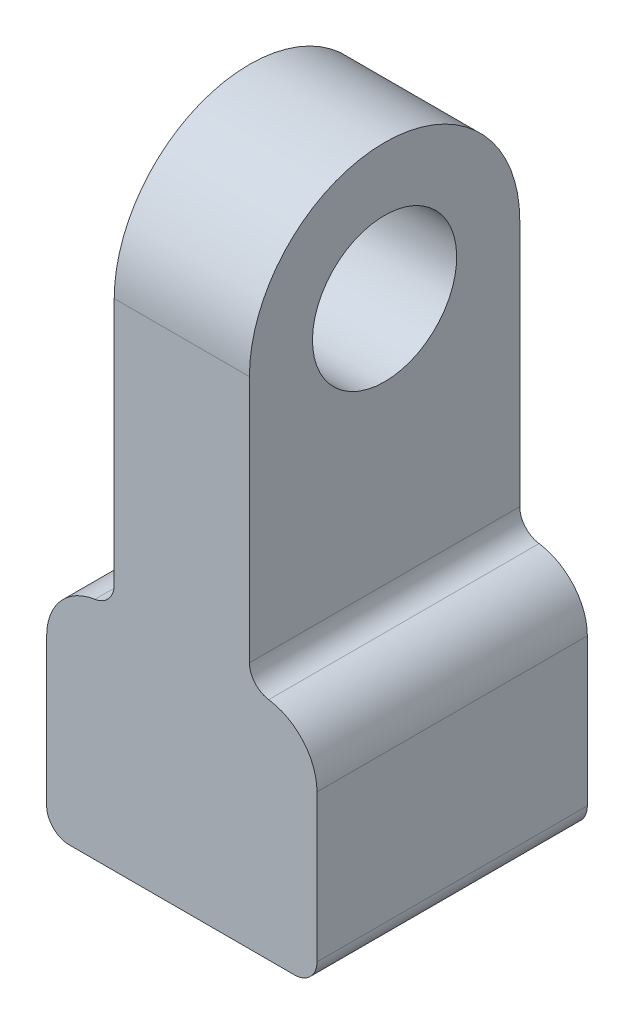
ISO-10303-21;
HEADER;
FILE_DESCRIPTION(('STEP AP214'),'2;1');
FILE_NAME('part.step','',(''),(''),'','','');
FILE_SCHEMA(('AUTOMOTIVE_DESIGN { 1 0 10303 214 1 1 1 1 }'));
ENDSEC;
DATA;
#1=APPLICATION_CONTEXT('core data for automotive mechanical design processes');
#2=APPLICATION_PROTOCOL_DEFINITION('international standard','automotive_design',2000,#1);
#3=PRODUCT_CONTEXT('',#1,'mechanical');
#4=PRODUCT('Part','Part','',(#3));
#5=PRODUCT_RELATED_PRODUCT_CATEGORY('part','',(#4));
#6=PRODUCT_DEFINITION_FORMATION('','',#4);
#7=PRODUCT_DEFINITION_CONTEXT('part definition',#1,'design');
#8=PRODUCT_DEFINITION('design','',#6,#7);
#9=PRODUCT_DEFINITION_SHAPE('','',#8);
#10=(LENGTH_UNIT() NAMED_UNIT(*) SI_UNIT(.MILLI.,.METRE.));
#11=(NAMED_UNIT(*) PLANE_ANGLE_UNIT() SI_UNIT($,.RADIAN.));
#12=(NAMED_UNIT(*) SI_UNIT($,.STERADIAN.) SOLID_ANGLE_UNIT());
#13=UNCERTAINTY_MEASURE_WITH_UNIT(LENGTH_MEASURE(1.E-05),#10,'distance_accuracy_value','');
#14=(GEOMETRIC_REPRESENTATION_CONTEXT(3) GLOBAL_UNCERTAINTY_ASSIGNED_CONTEXT((#13)) GLOBAL_UNIT_ASSIGNED_CONTEXT((#10,
#11,#12)) REPRESENTATION_CONTEXT('',''));
#15=CARTESIAN_POINT('',(0.,0.,0.));
#16=DIRECTION('',(0.,0.,1.));
#17=DIRECTION('',(1.,0.,0.));
#18=AXIS2_PLACEMENT_3D('',#15,#16,#17);
#19=CARTESIAN_POINT('',(-1.5,14.,3.));
#20=DIRECTION('',(1.,0.,0.));
#21=DIRECTION('',(0.,1.,0.));
#22=AXIS2_PLACEMENT_3D('',#19,#20,#21);
#23=PLANE('',#22);
#24=CARTESIAN_POINT('',(-1.5,11.,0.));
#25=DIRECTION('',(-1.,0.,0.));
#26=DIRECTION('',(0.,-1.,0.));
#27=AXIS2_PLACEMENT_3D('',#24,#25,#26);
#28=CIRCLE('',#27,1.6);
#29=CARTESIAN_POINT('',(-1.5,9.4,0.));
#30=VERTEX_POINT('',#29);
#31=EDGE_CURVE('E145',#30,#30,#28,.T.);
#32=ORIENTED_EDGE('',*,*,#31,.F.);
#33=EDGE_LOOP('',(#32));
#34=FACE_BOUND('',#33,.T.);
#35=DIRECTION('',(0.,-1.,0.));
#36=VECTOR('',#35,1.);
#37=CARTESIAN_POINT('',(-1.5,14.,3.));
#38=LINE('',#37,#36);
#39=CARTESIAN_POINT('',(-1.5,11.,3.));
#40=VERTEX_POINT('',#39);
#41=CARTESIAN_POINT('',(-1.5,5.5,3.));
#42=VERTEX_POINT('',#41);
#43=EDGE_CURVE('E129',#40,#42,#38,.T.);
#44=ORIENTED_EDGE('',*,*,#43,.F.);
#45=CARTESIAN_POINT('',(-1.5,11.,0.));
#46=DIRECTION('',(-1.,0.,0.));
#47=DIRECTION('',(0.,-1.,0.));
#48=AXIS2_PLACEMENT_3D('',#45,#46,#47);
#49=CIRCLE('',#48,3.);
#50=CARTESIAN_POINT('',(-1.5,11.,-3.));
#51=VERTEX_POINT('',#50);
#52=EDGE_CURVE('E121',#40,#51,#49,.T.);
#53=ORIENTED_EDGE('',*,*,#52,.T.);
#54=DIRECTION('',(0.,-1.,0.));
#55=VECTOR('',#54,1.);
#56=CARTESIAN_POINT('',(-1.5,14.,-3.));
#57=LINE('',#56,#55);
#58=CARTESIAN_POINT('',(-1.5,5.5,-3.));
#59=VERTEX_POINT('',#58);
#60=EDGE_CURVE('E155',#51,#59,#57,.T.);
#61=ORIENTED_EDGE('',*,*,#60,.T.);
#62=DIRECTION('',(0.,0.,-1.));
#63=VECTOR('',#62,1.);
#64=CARTESIAN_POINT('',(-1.5,5.5,3.));
#65=LINE('',#64,#63);
#66=EDGE_CURVE('E134',#59,#42,#65,.F.);
#67=ORIENTED_EDGE('',*,*,#66,.T.);
#68=EDGE_LOOP('',(#44,#53,#61,#67));
#69=FACE_BOUND('',#68,.T.);
#70=ADVANCED_FACE('F33',(#34,#69),#23,.F.);
#71=CARTESIAN_POINT('',(1.5,14.,3.));
#72=DIRECTION('',(-1.,0.,0.));
#73=DIRECTION('',(0.,-1.,0.));
#74=AXIS2_PLACEMENT_3D('',#71,#72,#73);
#75=PLANE('',#74);
#76=CARTESIAN_POINT('',(1.5,11.,0.));
#77=DIRECTION('',(-1.,0.,0.));
#78=DIRECTION('',(0.,-1.,0.));
#79=AXIS2_PLACEMENT_3D('',#76,#77,#78);
#80=CIRCLE('',#79,1.6);
#81=CARTESIAN_POINT('',(1.5,9.4,0.));
#82=VERTEX_POINT('',#81);
#83=EDGE_CURVE('E158',#82,#82,#80,.T.);
#84=ORIENTED_EDGE('',*,*,#83,.T.);
#85=EDGE_LOOP('',(#84));
#86=FACE_BOUND('',#85,.T.);
#87=CARTESIAN_POINT('',(1.5,11.,0.));
#88=DIRECTION('',(-1.,0.,0.));
#89=DIRECTION('',(0.,-1.,0.));
#90=AXIS2_PLACEMENT_3D('',#87,#88,#89);
#91=CIRCLE('',#90,3.);
#92=CARTESIAN_POINT('',(1.5,11.,3.));
#93=VERTEX_POINT('',#92);
#94=CARTESIAN_POINT('',(1.5,11.,-3.));
#95=VERTEX_POINT('',#94);
#96=EDGE_CURVE('E48',#93,#95,#91,.T.);
#97=ORIENTED_EDGE('',*,*,#96,.F.);
#98=DIRECTION('',(0.,1.,0.));
#99=VECTOR('',#98,1.);
#100=CARTESIAN_POINT('',(1.5,14.,3.));
#101=LINE('',#100,#99);
#102=CARTESIAN_POINT('',(1.5,5.5,3.));
#103=VERTEX_POINT('',#102);
#104=EDGE_CURVE('E132',#103,#93,#101,.T.);
#105=ORIENTED_EDGE('',*,*,#104,.F.);
#106=DIRECTION('',(0.,0.,-1.));
#107=VECTOR('',#106,1.);
#108=CARTESIAN_POINT('',(1.5,5.5,-3.));
#109=LINE('',#108,#107);
#110=CARTESIAN_POINT('',(1.5,5.5,-3.));
#111=VERTEX_POINT('',#110);
#112=EDGE_CURVE('E184',#103,#111,#109,.T.);
#113=ORIENTED_EDGE('',*,*,#112,.T.);
#114=DIRECTION('',(0.,1.,0.));
#115=VECTOR('',#114,1.);
#116=CARTESIAN_POINT('',(1.5,14.,-3.));
#117=LINE('',#116,#115);
#118=EDGE_CURVE('E137',#111,#95,#117,.T.);
#119=ORIENTED_EDGE('',*,*,#118,.T.);
#120=EDGE_LOOP('',(#97,#105,#113,#119));
#121=FACE_BOUND('',#120,.T.);
#122=ADVANCED_FACE('F262',(#86,#121),#75,.F.);
#123=CARTESIAN_POINT('',(-3.,5.,3.));
#124=DIRECTION('',(1.,0.,0.));
#125=DIRECTION('',(0.,1.,0.));
#126=AXIS2_PLACEMENT_3D('',#123,#124,#125);
#127=PLANE('',#126);
#128=DIRECTION('',(0.,-1.,0.));
#129=VECTOR('',#128,1.);
#130=CARTESIAN_POINT('',(-3.,5.,3.));
#131=LINE('',#130,#129);
#132=CARTESIAN_POINT('',(-3.,3.76794919243112,3.));
#133=VERTEX_POINT('',#132);
#134=CARTESIAN_POINT('',(-3.,0.5,3.));
#135=VERTEX_POINT('',#134);
#136=EDGE_CURVE('E136',#133,#135,#131,.T.);
#137=ORIENTED_EDGE('',*,*,#136,.F.);
#138=DIRECTION('',(0.,0.,1.));
#139=VECTOR('',#138,1.);
#140=CARTESIAN_POINT('',(-3.,3.76794919243112,3.));
#141=LINE('',#140,#139);
#142=CARTESIAN_POINT('',(-3.,3.76794919243112,-3.));
#143=VERTEX_POINT('',#142);
#144=EDGE_CURVE('E210',#133,#143,#141,.F.);
#145=ORIENTED_EDGE('',*,*,#144,.T.);
#146=DIRECTION('',(0.,-1.,0.));
#147=VECTOR('',#146,1.);
#148=CARTESIAN_POINT('',(-3.,5.,-3.));
#149=LINE('',#148,#147);
#150=CARTESIAN_POINT('',(-3.,0.5,-3.));
#151=VERTEX_POINT('',#150);
#152=EDGE_CURVE('E157',#143,#151,#149,.T.);
#153=ORIENTED_EDGE('',*,*,#152,.T.);
#154=DIRECTION('',(0.,0.,-1.));
#155=VECTOR('',#154,1.);
#156=CARTESIAN_POINT('',(-3.,0.5,3.));
#157=LINE('',#156,#155);
#158=EDGE_CURVE('E181',#151,#135,#157,.F.);
#159=ORIENTED_EDGE('',*,*,#158,.T.);
#160=EDGE_LOOP('',(#137,#145,#153,#159));
#161=FACE_BOUND('',#160,.T.);
#162=ADVANCED_FACE('F237',(#161),#127,.F.);
#163=CARTESIAN_POINT('',(-3.,0.,3.));
#164=DIRECTION('',(0.,1.,0.));
#165=DIRECTION('',(0.,0.,1.));
#166=AXIS2_PLACEMENT_3D('',#163,#164,#165);
#167=PLANE('',#166);
#168=CARTESIAN_POINT('',(0.,0.,0.));
#169=DIRECTION('',(0.,-1.,0.));
#170=DIRECTION('',(0.,0.,-1.));
#171=AXIS2_PLACEMENT_3D('',#168,#169,#170);
#172=CIRCLE('',#171,2.05);
#173=CARTESIAN_POINT('',(0.,0.,-2.05));
#174=VERTEX_POINT('',#173);
#175=EDGE_CURVE('E223',#174,#174,#172,.T.);
#176=ORIENTED_EDGE('',*,*,#175,.F.);
#177=EDGE_LOOP('',(#176));
#178=FACE_BOUND('',#177,.T.);
#179=DIRECTION('',(1.,0.,0.));
#180=VECTOR('',#179,1.);
#181=CARTESIAN_POINT('',(-3.,0.,-3.));
#182=LINE('',#181,#180);
#183=CARTESIAN_POINT('',(-2.5,0.,-3.));
#184=VERTEX_POINT('',#183);
#185=CARTESIAN_POINT('',(2.5,0.,-3.));
#186=VERTEX_POINT('',#185);
#187=EDGE_CURVE('E160',#184,#186,#182,.T.);
#188=ORIENTED_EDGE('',*,*,#187,.T.);
#189=DIRECTION('',(0.,0.,-1.));
#190=VECTOR('',#189,1.);
#191=CARTESIAN_POINT('',(2.5,0.,3.));
#192=LINE('',#191,#190);
#193=CARTESIAN_POINT('',(2.5,0.,3.));
#194=VERTEX_POINT('',#193);
#195=EDGE_CURVE('E175',#186,#194,#192,.F.);
#196=ORIENTED_EDGE('',*,*,#195,.T.);
#197=DIRECTION('',(1.,0.,0.));
#198=VECTOR('',#197,1.);
#199=CARTESIAN_POINT('',(-3.,0.,3.));
#200=LINE('',#199,#198);
#201=CARTESIAN_POINT('',(-2.5,0.,3.));
#202=VERTEX_POINT('',#201);
#203=EDGE_CURVE('E139',#202,#194,#200,.T.);
#204=ORIENTED_EDGE('',*,*,#203,.F.);
#205=DIRECTION('',(0.,0.,-1.));
#206=VECTOR('',#205,1.);
#207=CARTESIAN_POINT('',(-2.5,0.,3.));
#208=LINE('',#207,#206);
#209=EDGE_CURVE('E172',#202,#184,#208,.T.);
#210=ORIENTED_EDGE('',*,*,#209,.T.);
#211=EDGE_LOOP('',(#188,#196,#204,#210));
#212=FACE_BOUND('',#211,.T.);
#213=ADVANCED_FACE('F233',(#178,#212),#167,.F.);
#214=CARTESIAN_POINT('',(3.,5.,3.));
#215=DIRECTION('',(-1.,0.,0.));
#216=DIRECTION('',(0.,-1.,0.));
#217=AXIS2_PLACEMENT_3D('',#214,#215,#216);
#218=PLANE('',#217);
#219=DIRECTION('',(0.,1.,0.));
#220=VECTOR('',#219,1.);
#221=CARTESIAN_POINT('',(3.,5.,-3.));
#222=LINE('',#221,#220);
#223=CARTESIAN_POINT('',(3.,0.5,-3.));
#224=VERTEX_POINT('',#223);
#225=CARTESIAN_POINT('',(3.,3.76794919243112,-3.));
#226=VERTEX_POINT('',#225);
#227=EDGE_CURVE('E142',#224,#226,#222,.T.);
#228=ORIENTED_EDGE('',*,*,#227,.T.);
#229=DIRECTION('',(0.,0.,1.));
#230=VECTOR('',#229,1.);
#231=CARTESIAN_POINT('',(3.,3.76794919243112,3.));
#232=LINE('',#231,#230);
#233=CARTESIAN_POINT('',(3.,3.76794919243112,3.));
#234=VERTEX_POINT('',#233);
#235=EDGE_CURVE('E205',#226,#234,#232,.T.);
#236=ORIENTED_EDGE('',*,*,#235,.T.);
#237=DIRECTION('',(0.,1.,0.));
#238=VECTOR('',#237,1.);
#239=CARTESIAN_POINT('',(3.,5.,3.));
#240=LINE('',#239,#238);
#241=CARTESIAN_POINT('',(3.,0.5,3.));
#242=VERTEX_POINT('',#241);
#243=EDGE_CURVE('E150',#242,#234,#240,.T.);
#244=ORIENTED_EDGE('',*,*,#243,.F.);
#245=DIRECTION('',(0.,0.,-1.));
#246=VECTOR('',#245,1.);
#247=CARTESIAN_POINT('',(3.,0.5,3.));
#248=LINE('',#247,#246);
#249=EDGE_CURVE('E154',#242,#224,#248,.T.);
#250=ORIENTED_EDGE('',*,*,#249,.T.);
#251=EDGE_LOOP('',(#228,#236,#244,#250));
#252=FACE_BOUND('',#251,.T.);
#253=ADVANCED_FACE('F236',(#252),#218,.F.);
#254=CARTESIAN_POINT('',(0.,0.,3.));
#255=DIRECTION('',(0.,0.,-1.));
#256=DIRECTION('',(-1.,0.,0.));
#257=AXIS2_PLACEMENT_3D('',#254,#255,#256);
#258=PLANE('',#257);
#259=ORIENTED_EDGE('',*,*,#104,.T.);
#260=DIRECTION('',(-1.,0.,0.));
#261=VECTOR('',#260,1.);
#262=CARTESIAN_POINT('',(3.,11.,3.));
#263=LINE('',#262,#261);
#264=EDGE_CURVE('E11',#93,#40,#263,.T.);
#265=ORIENTED_EDGE('',*,*,#264,.T.);
#266=ORIENTED_EDGE('',*,*,#43,.T.);
#267=CARTESIAN_POINT('',(-2.,5.5,3.));
#268=DIRECTION('',(0.,0.,-1.));
#269=DIRECTION('',(-1.,0.,0.));
#270=AXIS2_PLACEMENT_3D('',#267,#268,#269);
#271=CIRCLE('',#270,0.5);
#272=CARTESIAN_POINT('',(-1.92857142857143,5.00512834069461,3.));
#273=VERTEX_POINT('',#272);
#274=EDGE_CURVE('E196',#42,#273,#271,.T.);
#275=ORIENTED_EDGE('',*,*,#274,.T.);
#276=CARTESIAN_POINT('',(-1.75,3.76794919243112,3.));
#277=DIRECTION('',(0.,0.,-1.));
#278=DIRECTION('',(-1.,0.,0.));
#279=AXIS2_PLACEMENT_3D('',#276,#277,#278);
#280=CIRCLE('',#279,1.25);
#281=EDGE_CURVE('E56',#273,#133,#280,.F.);
#282=ORIENTED_EDGE('',*,*,#281,.T.);
#283=ORIENTED_EDGE('',*,*,#136,.T.);
#284=CARTESIAN_POINT('',(-2.5,0.5,3.));
#285=DIRECTION('',(0.,0.,-1.));
#286=DIRECTION('',(-1.,0.,0.));
#287=AXIS2_PLACEMENT_3D('',#284,#285,#286);
#288=CIRCLE('',#287,0.5);
#289=EDGE_CURVE('E177',#135,#202,#288,.F.);
#290=ORIENTED_EDGE('',*,*,#289,.T.);
#291=ORIENTED_EDGE('',*,*,#203,.T.);
#292=CARTESIAN_POINT('',(2.5,0.5,3.));
#293=DIRECTION('',(0.,0.,-1.));
#294=DIRECTION('',(-1.,0.,0.));
#295=AXIS2_PLACEMENT_3D('',#292,#293,#294);
#296=CIRCLE('',#295,0.5);
#297=EDGE_CURVE('E179',#194,#242,#296,.F.);
#298=ORIENTED_EDGE('',*,*,#297,.T.);
#299=ORIENTED_EDGE('',*,*,#243,.T.);
#300=CARTESIAN_POINT('',(1.75,3.76794919243112,3.));
#301=DIRECTION('',(0.,0.,-1.));
#302=DIRECTION('',(-1.,0.,0.));
#303=AXIS2_PLACEMENT_3D('',#300,#301,#302);
#304=CIRCLE('',#303,1.25);
#305=CARTESIAN_POINT('',(1.92857142857143,5.00512834069461,3.));
#306=VERTEX_POINT('',#305);
#307=EDGE_CURVE('E208',#234,#306,#304,.F.);
#308=ORIENTED_EDGE('',*,*,#307,.T.);
#309=CARTESIAN_POINT('',(2.,5.5,3.));
#310=DIRECTION('',(0.,0.,-1.));
#311=DIRECTION('',(-1.,0.,0.));
#312=AXIS2_PLACEMENT_3D('',#309,#310,#311);
#313=CIRCLE('',#312,0.5);
#314=EDGE_CURVE('E191',#306,#103,#313,.T.);
#315=ORIENTED_EDGE('',*,*,#314,.T.);
#316=EDGE_LOOP('',(#259,#265,#266,#275,#282,#283,#290,#291,#298,#299,#308,#315));
#317=FACE_BOUND('',#316,.T.);
#318=ADVANCED_FACE('F128',(#317),#258,.F.);
#319=CARTESIAN_POINT('',(0.,0.,-3.));
#320=DIRECTION('',(0.,0.,-1.));
#321=DIRECTION('',(-1.,0.,0.));
#322=AXIS2_PLACEMENT_3D('',#319,#320,#321);
#323=PLANE('',#322);
#324=DIRECTION('',(-1.,0.,0.));
#325=VECTOR('',#324,1.);
#326=CARTESIAN_POINT('',(3.,11.,-3.));
#327=LINE('',#326,#325);
#328=EDGE_CURVE('E41',#95,#51,#327,.T.);
#329=ORIENTED_EDGE('',*,*,#328,.F.);
#330=ORIENTED_EDGE('',*,*,#118,.F.);
#331=CARTESIAN_POINT('',(2.,5.5,-3.));
#332=DIRECTION('',(0.,0.,-1.));
#333=DIRECTION('',(-1.,0.,0.));
#334=AXIS2_PLACEMENT_3D('',#331,#332,#333);
#335=CIRCLE('',#334,0.5);
#336=CARTESIAN_POINT('',(1.92857142857143,5.00512834069461,-3.));
#337=VERTEX_POINT('',#336);
#338=EDGE_CURVE('E188',#111,#337,#335,.F.);
#339=ORIENTED_EDGE('',*,*,#338,.T.);
#340=CARTESIAN_POINT('',(1.75,3.76794919243112,-3.));
#341=DIRECTION('',(0.,0.,-1.));
#342=DIRECTION('',(-1.,0.,0.));
#343=AXIS2_PLACEMENT_3D('',#340,#341,#342);
#344=CIRCLE('',#343,1.25);
#345=EDGE_CURVE('E203',#337,#226,#344,.T.);
#346=ORIENTED_EDGE('',*,*,#345,.T.);
#347=ORIENTED_EDGE('',*,*,#227,.F.);
#348=CARTESIAN_POINT('',(2.5,0.5,-3.));
#349=DIRECTION('',(0.,0.,-1.));
#350=DIRECTION('',(-1.,0.,0.));
#351=AXIS2_PLACEMENT_3D('',#348,#349,#350);
#352=CIRCLE('',#351,0.5);
#353=EDGE_CURVE('E170',#224,#186,#352,.T.);
#354=ORIENTED_EDGE('',*,*,#353,.T.);
#355=ORIENTED_EDGE('',*,*,#187,.F.);
#356=CARTESIAN_POINT('',(-2.5,0.5,-3.));
#357=DIRECTION('',(0.,0.,-1.));
#358=DIRECTION('',(-1.,0.,0.));
#359=AXIS2_PLACEMENT_3D('',#356,#357,#358);
#360=CIRCLE('',#359,0.5);
#361=EDGE_CURVE('E167',#184,#151,#360,.T.);
#362=ORIENTED_EDGE('',*,*,#361,.T.);
#363=ORIENTED_EDGE('',*,*,#152,.F.);
#364=CARTESIAN_POINT('',(-1.75,3.76794919243112,-3.));
#365=DIRECTION('',(0.,0.,-1.));
#366=DIRECTION('',(-1.,0.,0.));
#367=AXIS2_PLACEMENT_3D('',#364,#365,#366);
#368=CIRCLE('',#367,1.25);
#369=CARTESIAN_POINT('',(-1.92857142857143,5.00512834069461,-3.));
#370=VERTEX_POINT('',#369);
#371=EDGE_CURVE('E201',#143,#370,#368,.T.);
#372=ORIENTED_EDGE('',*,*,#371,.T.);
#373=CARTESIAN_POINT('',(-2.,5.5,-3.));
#374=DIRECTION('',(0.,0.,-1.));
#375=DIRECTION('',(-1.,0.,0.));
#376=AXIS2_PLACEMENT_3D('',#373,#374,#375);
#377=CIRCLE('',#376,0.5);
#378=EDGE_CURVE('E193',#370,#59,#377,.F.);
#379=ORIENTED_EDGE('',*,*,#378,.T.);
#380=ORIENTED_EDGE('',*,*,#60,.F.);
#381=EDGE_LOOP('',(#329,#330,#339,#346,#347,#354,#355,#362,#363,#372,#379,#380));
#382=FACE_BOUND('',#381,.T.);
#383=ADVANCED_FACE('F263',(#382),#323,.T.);
#384=CARTESIAN_POINT('',(2.5,0.5,3.));
#385=DIRECTION('',(0.,0.,-1.));
#386=DIRECTION('',(-1.,0.,0.));
#387=AXIS2_PLACEMENT_3D('',#384,#385,#386);
#388=CYLINDRICAL_SURFACE('',#387,0.5);
#389=ORIENTED_EDGE('',*,*,#297,.F.);
#390=ORIENTED_EDGE('',*,*,#195,.F.);
#391=ORIENTED_EDGE('',*,*,#353,.F.);
#392=ORIENTED_EDGE('',*,*,#249,.F.);
#393=EDGE_LOOP('',(#389,#390,#391,#392));
#394=FACE_BOUND('',#393,.T.);
#395=ADVANCED_FACE('F246',(#394),#388,.T.);
#396=CARTESIAN_POINT('',(-2.5,0.5,3.));
#397=DIRECTION('',(0.,0.,-1.));
#398=DIRECTION('',(-1.,0.,0.));
#399=AXIS2_PLACEMENT_3D('',#396,#397,#398);
#400=CYLINDRICAL_SURFACE('',#399,0.5);
#401=ORIENTED_EDGE('',*,*,#289,.F.);
#402=ORIENTED_EDGE('',*,*,#158,.F.);
#403=ORIENTED_EDGE('',*,*,#361,.F.);
#404=ORIENTED_EDGE('',*,*,#209,.F.);
#405=EDGE_LOOP('',(#401,#402,#403,#404));
#406=FACE_BOUND('',#405,.T.);
#407=ADVANCED_FACE('F275',(#406),#400,.T.);
#408=CARTESIAN_POINT('',(2.,5.5,3.));
#409=DIRECTION('',(0.,0.,1.));
#410=DIRECTION('',(1.,0.,0.));
#411=AXIS2_PLACEMENT_3D('',#408,#409,#410);
#412=CYLINDRICAL_SURFACE('',#411,0.5);
#413=ORIENTED_EDGE('',*,*,#314,.F.);
#414=DIRECTION('',(0.,0.,1.));
#415=VECTOR('',#414,1.);
#416=CARTESIAN_POINT('',(1.92857142857143,5.00512834069461,3.));
#417=LINE('',#416,#415);
#418=EDGE_CURVE('E198',#306,#337,#417,.F.);
#419=ORIENTED_EDGE('',*,*,#418,.T.);
#420=ORIENTED_EDGE('',*,*,#338,.F.);
#421=ORIENTED_EDGE('',*,*,#112,.F.);
#422=EDGE_LOOP('',(#413,#419,#420,#421));
#423=FACE_BOUND('',#422,.T.);
#424=ADVANCED_FACE('F259',(#423),#412,.F.);
#425=CARTESIAN_POINT('',(-2.,5.5,3.));
#426=DIRECTION('',(0.,0.,1.));
#427=DIRECTION('',(1.,0.,0.));
#428=AXIS2_PLACEMENT_3D('',#425,#426,#427);
#429=CYLINDRICAL_SURFACE('',#428,0.5);
#430=ORIENTED_EDGE('',*,*,#378,.F.);
#431=DIRECTION('',(0.,0.,1.));
#432=VECTOR('',#431,1.);
#433=CARTESIAN_POINT('',(-1.92857142857143,5.00512834069461,3.));
#434=LINE('',#433,#432);
#435=EDGE_CURVE('E213',#370,#273,#434,.T.);
#436=ORIENTED_EDGE('',*,*,#435,.T.);
#437=ORIENTED_EDGE('',*,*,#274,.F.);
#438=ORIENTED_EDGE('',*,*,#66,.F.);
#439=EDGE_LOOP('',(#430,#436,#437,#438));
#440=FACE_BOUND('',#439,.T.);
#441=ADVANCED_FACE('F268',(#440),#429,.F.);
#442=CARTESIAN_POINT('',(1.75,3.76794919243112,3.));
#443=DIRECTION('',(0.,0.,1.));
#444=DIRECTION('',(1.,0.,0.));
#445=AXIS2_PLACEMENT_3D('',#442,#443,#444);
#446=CYLINDRICAL_SURFACE('',#445,1.25);
#447=ORIENTED_EDGE('',*,*,#307,.F.);
#448=ORIENTED_EDGE('',*,*,#235,.F.);
#449=ORIENTED_EDGE('',*,*,#345,.F.);
#450=ORIENTED_EDGE('',*,*,#418,.F.);
#451=EDGE_LOOP('',(#447,#448,#449,#450));
#452=FACE_BOUND('',#451,.T.);
#453=ADVANCED_FACE('F254',(#452),#446,.T.);
#454=CARTESIAN_POINT('',(-1.75,3.76794919243112,3.));
#455=DIRECTION('',(0.,0.,1.));
#456=DIRECTION('',(1.,0.,0.));
#457=AXIS2_PLACEMENT_3D('',#454,#455,#456);
#458=CYLINDRICAL_SURFACE('',#457,1.25);
#459=ORIENTED_EDGE('',*,*,#281,.F.);
#460=ORIENTED_EDGE('',*,*,#435,.F.);
#461=ORIENTED_EDGE('',*,*,#371,.F.);
#462=ORIENTED_EDGE('',*,*,#144,.F.);
#463=EDGE_LOOP('',(#459,#460,#461,#462));
#464=FACE_BOUND('',#463,.T.);
#465=ADVANCED_FACE('F35',(#464),#458,.T.);
#466=CARTESIAN_POINT('',(3.,11.,0.));
#467=DIRECTION('',(-1.,0.,0.));
#468=DIRECTION('',(0.,-1.,0.));
#469=AXIS2_PLACEMENT_3D('',#466,#467,#468);
#470=CYLINDRICAL_SURFACE('',#469,1.6);
#471=ORIENTED_EDGE('',*,*,#31,.T.);
#472=EDGE_LOOP('',(#471));
#473=FACE_BOUND('',#472,.T.);
#474=ORIENTED_EDGE('',*,*,#83,.F.);
#475=EDGE_LOOP('',(#474));
#476=FACE_BOUND('',#475,.T.);
#477=ADVANCED_FACE('F300',(#473,#476),#470,.F.);
#478=CARTESIAN_POINT('',(0.,4.,0.));
#479=DIRECTION('',(0.,-1.,0.));
#480=DIRECTION('',(0.,0.,-1.));
#481=AXIS2_PLACEMENT_3D('',#478,#479,#480);
#482=CYLINDRICAL_SURFACE('',#481,2.05);
#483=CARTESIAN_POINT('',(0.,4.,0.));
#484=DIRECTION('',(0.,-1.,0.));
#485=DIRECTION('',(0.,0.,-1.));
#486=AXIS2_PLACEMENT_3D('',#483,#484,#485);
#487=CIRCLE('',#486,2.05);
#488=CARTESIAN_POINT('',(0.,4.,-2.05));
#489=VERTEX_POINT('',#488);
#490=EDGE_CURVE('E219',#489,#489,#487,.T.);
#491=ORIENTED_EDGE('',*,*,#490,.F.);
#492=EDGE_LOOP('',(#491));
#493=FACE_BOUND('',#492,.T.);
#494=ORIENTED_EDGE('',*,*,#175,.T.);
#495=EDGE_LOOP('',(#494));
#496=FACE_BOUND('',#495,.T.);
#497=ADVANCED_FACE('F231',(#493,#496),#482,.F.);
#498=CARTESIAN_POINT('',(0.,4.,0.));
#499=DIRECTION('',(0.,-1.,0.));
#500=DIRECTION('',(0.,0.,-1.));
#501=AXIS2_PLACEMENT_3D('',#498,#499,#500);
#502=PLANE('',#501);
#503=ORIENTED_EDGE('',*,*,#490,.T.);
#504=EDGE_LOOP('',(#503));
#505=FACE_BOUND('',#504,.T.);
#506=ADVANCED_FACE('F305',(#505),#502,.T.);
#507=CARTESIAN_POINT('',(3.,11.,0.));
#508=DIRECTION('',(-1.,0.,0.));
#509=DIRECTION('',(0.,-1.,0.));
#510=AXIS2_PLACEMENT_3D('',#507,#508,#509);
#511=CYLINDRICAL_SURFACE('',#510,3.);
#512=ORIENTED_EDGE('',*,*,#96,.T.);
#513=ORIENTED_EDGE('',*,*,#328,.T.);
#514=ORIENTED_EDGE('',*,*,#52,.F.);
#515=ORIENTED_EDGE('',*,*,#264,.F.);
#516=EDGE_LOOP('',(#512,#513,#514,#515));
#517=FACE_BOUND('',#516,.T.);
#518=ADVANCED_FACE('F122',(#517),#511,.T.);
#519=CLOSED_SHELL('',(#70,#122,#162,#213,#253,#318,#383,#395,#407,#424,#441,#453,#465,#477,#497,
#506,#518));
#520=MANIFOLD_SOLID_BREP('B2',#519);
#521=ADVANCED_BREP_SHAPE_REPRESENTATION('',(#18,#520),#14);
#522=SHAPE_DEFINITION_REPRESENTATION(#9,#521);
ENDSEC;
END-ISO-10303-21;
